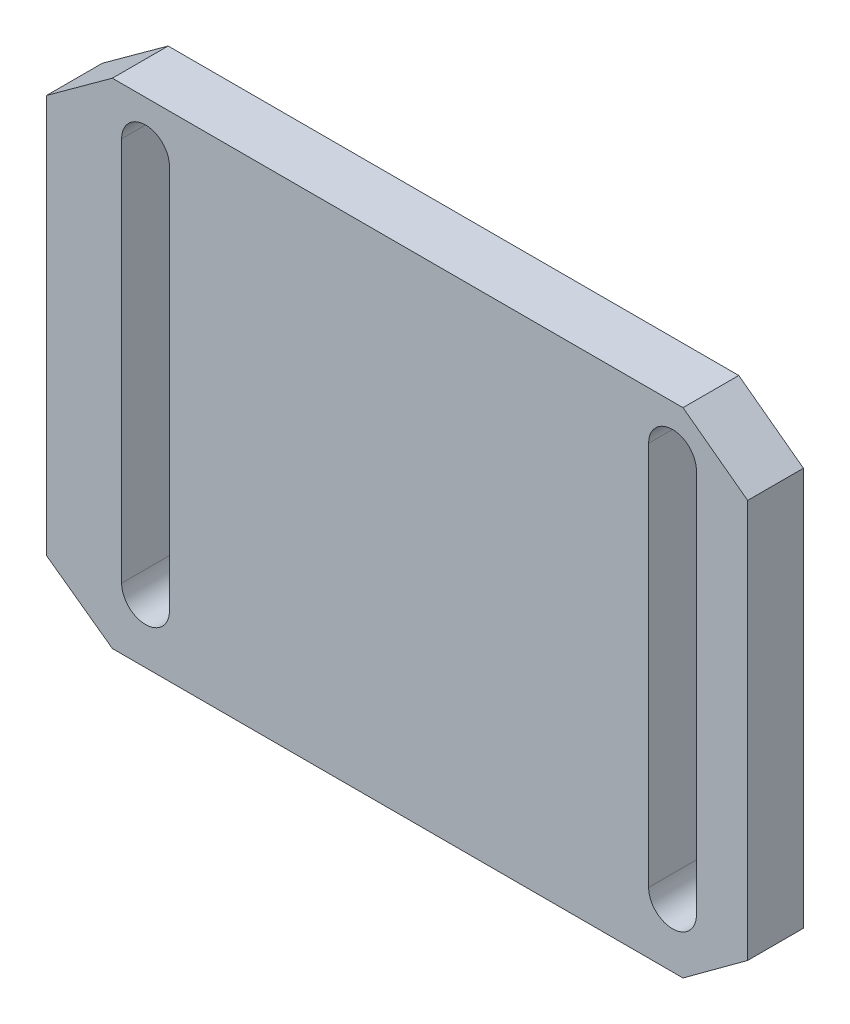
ISO-10303-21;
HEADER;
FILE_DESCRIPTION(('STEP AP214'),'2;1');
FILE_NAME('part.step','',(''),(''),'','','');
FILE_SCHEMA(('AUTOMOTIVE_DESIGN { 1 0 10303 214 1 1 1 1 }'));
ENDSEC;
DATA;
#1=APPLICATION_CONTEXT('core data for automotive mechanical design processes');
#2=APPLICATION_PROTOCOL_DEFINITION('international standard','automotive_design',2000,#1);
#3=PRODUCT_CONTEXT('',#1,'mechanical');
#4=PRODUCT('Part','Part','',(#3));
#5=PRODUCT_RELATED_PRODUCT_CATEGORY('part','',(#4));
#6=PRODUCT_DEFINITION_FORMATION('','',#4);
#7=PRODUCT_DEFINITION_CONTEXT('part definition',#1,'design');
#8=PRODUCT_DEFINITION('design','',#6,#7);
#9=PRODUCT_DEFINITION_SHAPE('','',#8);
#10=(LENGTH_UNIT() NAMED_UNIT(*) SI_UNIT(.MILLI.,.METRE.));
#11=(NAMED_UNIT(*) PLANE_ANGLE_UNIT() SI_UNIT($,.RADIAN.));
#12=(NAMED_UNIT(*) SI_UNIT($,.STERADIAN.) SOLID_ANGLE_UNIT());
#13=UNCERTAINTY_MEASURE_WITH_UNIT(LENGTH_MEASURE(1.E-05),#10,'distance_accuracy_value','');
#14=(GEOMETRIC_REPRESENTATION_CONTEXT(3) GLOBAL_UNCERTAINTY_ASSIGNED_CONTEXT((#13)) GLOBAL_UNIT_ASSIGNED_CONTEXT((#10,
#11,#12)) REPRESENTATION_CONTEXT('',''));
#15=CARTESIAN_POINT('',(0.,0.,0.));
#16=DIRECTION('',(0.,0.,1.));
#17=DIRECTION('',(1.,0.,0.));
#18=AXIS2_PLACEMENT_3D('',#15,#16,#17);
#19=CARTESIAN_POINT('',(0.,0.,7000.));
#20=DIRECTION('',(0.,0.,-1.));
#21=DIRECTION('',(-1.,0.,0.));
#22=AXIS2_PLACEMENT_3D('',#19,#20,#21);
#23=PLANE('',#22);
#24=CARTESIAN_POINT('',(-75575.7324296501,55993.9133640553,7000.));
#25=DIRECTION('',(0.,0.,1.));
#26=DIRECTION('',(1.,0.,0.));
#27=AXIS2_PLACEMENT_3D('',#24,#25,#26);
#28=CIRCLE('',#27,3000.);
#29=CARTESIAN_POINT('',(-72575.7324296501,55993.9133640553,7000.));
#30=VERTEX_POINT('',#29);
#31=CARTESIAN_POINT('',(-78575.7324296501,55993.9133640553,7000.));
#32=VERTEX_POINT('',#31);
#33=EDGE_CURVE('E259',#30,#32,#28,.T.);
#34=ORIENTED_EDGE('',*,*,#33,.F.);
#35=DIRECTION('',(0.,-1.,0.));
#36=VECTOR('',#35,1.);
#37=CARTESIAN_POINT('',(-72575.7324296501,55993.9133640553,7000.));
#38=LINE('',#37,#36);
#39=CARTESIAN_POINT('',(-72575.7324296501,7685.31988644327,7000.));
#40=VERTEX_POINT('',#39);
#41=EDGE_CURVE('E268',#30,#40,#38,.T.);
#42=ORIENTED_EDGE('',*,*,#41,.T.);
#43=CARTESIAN_POINT('',(-75575.7324296501,7685.31988644327,7000.));
#44=DIRECTION('',(0.,0.,1.));
#45=DIRECTION('',(1.,0.,0.));
#46=AXIS2_PLACEMENT_3D('',#43,#44,#45);
#47=CIRCLE('',#46,2999.99999999999);
#48=CARTESIAN_POINT('',(-78575.7324296501,7685.31988644327,7000.));
#49=VERTEX_POINT('',#48);
#50=EDGE_CURVE('E262',#49,#40,#47,.T.);
#51=ORIENTED_EDGE('',*,*,#50,.F.);
#52=DIRECTION('',(0.,-1.,0.));
#53=VECTOR('',#52,1.);
#54=CARTESIAN_POINT('',(-78575.7324296501,55993.9133640553,7000.));
#55=LINE('',#54,#53);
#56=EDGE_CURVE('E265',#32,#49,#55,.T.);
#57=ORIENTED_EDGE('',*,*,#56,.F.);
#58=EDGE_LOOP('',(#34,#42,#51,#57));
#59=FACE_BOUND('',#58,.T.);
#60=DIRECTION('',(-0.810686411900085,0.585480607330906,0.));
#61=VECTOR('',#60,1.);
#62=CARTESIAN_POINT('',(-79740.5270045505,-6.08663594470046,7000.));
#63=LINE('',#62,#61);
#64=CARTESIAN_POINT('',(-79740.5270045505,-6.08663594470046,7000.));
#65=VERTEX_POINT('',#64);
#66=CARTESIAN_POINT('',(-87997.4248847926,5957.074352856,7000.));
#67=VERTEX_POINT('',#66);
#68=EDGE_CURVE('E295',#65,#67,#63,.T.);
#69=ORIENTED_EDGE('',*,*,#68,.F.);
#70=DIRECTION('',(1.,0.,0.));
#71=VECTOR('',#70,1.);
#72=CARTESIAN_POINT('',(-79740.5270045505,-6.08663594470046,7000.));
#73=LINE('',#72,#71);
#74=CARTESIAN_POINT('',(-8114.14575819188,-6.08663594470046,7000.));
#75=VERTEX_POINT('',#74);
#76=EDGE_CURVE('E307',#65,#75,#73,.T.);
#77=ORIENTED_EDGE('',*,*,#76,.T.);
#78=DIRECTION('',(0.80588864150749,0.5920671393425,0.));
#79=VECTOR('',#78,1.);
#80=CARTESIAN_POINT('',(-8114.14575819188,-6.08663594470046,7000.));
#81=LINE('',#80,#79);
#82=CARTESIAN_POINT('',(2.57511520737252,5957.074352856,7000.));
#83=VERTEX_POINT('',#82);
#84=EDGE_CURVE('E306',#75,#83,#81,.T.);
#85=ORIENTED_EDGE('',*,*,#84,.T.);
#86=DIRECTION('',(0.,-1.,0.));
#87=VECTOR('',#86,1.);
#88=CARTESIAN_POINT('',(2.57511520736639,55969.0740995109,7000.));
#89=LINE('',#88,#87);
#90=CARTESIAN_POINT('',(2.57511520736639,55969.0740995109,7000.));
#91=VERTEX_POINT('',#90);
#92=EDGE_CURVE('E304',#91,#83,#89,.T.);
#93=ORIENTED_EDGE('',*,*,#92,.F.);
#94=DIRECTION('',(-0.80296754052975,0.596022758672523,0.));
#95=VECTOR('',#94,1.);
#96=CARTESIAN_POINT('',(2.57511520736639,55969.0740995109,7000.));
#97=LINE('',#96,#95);
#98=CARTESIAN_POINT('',(-8114.14575819188,61993.9133640553,7000.));
#99=VERTEX_POINT('',#98);
#100=EDGE_CURVE('E301',#91,#99,#97,.T.);
#101=ORIENTED_EDGE('',*,*,#100,.T.);
#102=DIRECTION('',(1.,0.,0.));
#103=VECTOR('',#102,1.);
#104=CARTESIAN_POINT('',(-79740.5270045505,61993.9133640553,7000.));
#105=LINE('',#104,#103);
#106=CARTESIAN_POINT('',(-79740.5270045505,61993.9133640553,7000.));
#107=VERTEX_POINT('',#106);
#108=EDGE_CURVE('E300',#107,#99,#105,.T.);
#109=ORIENTED_EDGE('',*,*,#108,.F.);
#110=DIRECTION('',(-0.80896981760848,-0.587850180061639,0.));
#111=VECTOR('',#110,1.);
#112=CARTESIAN_POINT('',(-79740.5270045505,61993.9133640553,7000.));
#113=LINE('',#112,#111);
#114=CARTESIAN_POINT('',(-87997.4248847926,55993.9133640553,7000.));
#115=VERTEX_POINT('',#114);
#116=EDGE_CURVE('E299',#107,#115,#113,.T.);
#117=ORIENTED_EDGE('',*,*,#116,.T.);
#118=DIRECTION('',(0.,-1.,0.));
#119=VECTOR('',#118,1.);
#120=CARTESIAN_POINT('',(-87997.4248847926,55993.9133640553,7000.));
#121=LINE('',#120,#119);
#122=EDGE_CURVE('E293',#115,#67,#121,.T.);
#123=ORIENTED_EDGE('',*,*,#122,.T.);
#124=EDGE_LOOP('',(#69,#77,#85,#93,#101,#109,#117,#123));
#125=FACE_BOUND('',#124,.T.);
#126=CARTESIAN_POINT('',(-9427.33930635532,55969.0740995109,7000.));
#127=DIRECTION('',(0.,0.,1.));
#128=DIRECTION('',(1.,0.,0.));
#129=AXIS2_PLACEMENT_3D('',#126,#127,#128);
#130=CIRCLE('',#129,3000.);
#131=CARTESIAN_POINT('',(-6427.33930635532,55969.0740995109,7000.));
#132=VERTEX_POINT('',#131);
#133=CARTESIAN_POINT('',(-12427.3393063553,55969.0740995109,7000.));
#134=VERTEX_POINT('',#133);
#135=EDGE_CURVE('E224',#132,#134,#130,.T.);
#136=ORIENTED_EDGE('',*,*,#135,.F.);
#137=DIRECTION('',(0.,-1.,0.));
#138=VECTOR('',#137,1.);
#139=CARTESIAN_POINT('',(-6427.33930635532,55969.0740995109,7000.));
#140=LINE('',#139,#138);
#141=CARTESIAN_POINT('',(-6427.33930635532,7685.31988644327,7000.));
#142=VERTEX_POINT('',#141);
#143=EDGE_CURVE('E250',#132,#142,#140,.T.);
#144=ORIENTED_EDGE('',*,*,#143,.T.);
#145=CARTESIAN_POINT('',(-9427.33930635532,7685.31988644327,7000.));
#146=DIRECTION('',(0.,0.,1.));
#147=DIRECTION('',(1.,0.,0.));
#148=AXIS2_PLACEMENT_3D('',#145,#146,#147);
#149=CIRCLE('',#148,3000.);
#150=CARTESIAN_POINT('',(-12427.3393063553,7685.31988644327,7000.));
#151=VERTEX_POINT('',#150);
#152=EDGE_CURVE('E245',#151,#142,#149,.T.);
#153=ORIENTED_EDGE('',*,*,#152,.F.);
#154=DIRECTION('',(0.,-1.,0.));
#155=VECTOR('',#154,1.);
#156=CARTESIAN_POINT('',(-12427.3393063553,55969.0740995109,7000.));
#157=LINE('',#156,#155);
#158=EDGE_CURVE('E232',#134,#151,#157,.T.);
#159=ORIENTED_EDGE('',*,*,#158,.F.);
#160=EDGE_LOOP('',(#136,#144,#153,#159));
#161=FACE_BOUND('',#160,.T.);
#162=ADVANCED_FACE('F112',(#59,#125,#161),#23,.F.);
#163=CARTESIAN_POINT('',(0.,0.,0.));
#164=DIRECTION('',(0.,0.,-1.));
#165=DIRECTION('',(-1.,0.,0.));
#166=AXIS2_PLACEMENT_3D('',#163,#164,#165);
#167=PLANE('',#166);
#168=DIRECTION('',(-0.810686411900085,0.585480607330906,0.));
#169=VECTOR('',#168,1.);
#170=CARTESIAN_POINT('',(-79740.5270045505,-6.08663594470046,0.));
#171=LINE('',#170,#169);
#172=CARTESIAN_POINT('',(-79740.5270045505,-6.08663594470046,0.));
#173=VERTEX_POINT('',#172);
#174=CARTESIAN_POINT('',(-87997.4248847926,5957.074352856,0.));
#175=VERTEX_POINT('',#174);
#176=EDGE_CURVE('E292',#173,#175,#171,.T.);
#177=ORIENTED_EDGE('',*,*,#176,.T.);
#178=DIRECTION('',(0.,-1.,0.));
#179=VECTOR('',#178,1.);
#180=CARTESIAN_POINT('',(-87997.4248847926,55993.9133640553,0.));
#181=LINE('',#180,#179);
#182=CARTESIAN_POINT('',(-87997.4248847926,55993.9133640553,0.));
#183=VERTEX_POINT('',#182);
#184=EDGE_CURVE('E312',#183,#175,#181,.T.);
#185=ORIENTED_EDGE('',*,*,#184,.F.);
#186=DIRECTION('',(-0.80896981760848,-0.587850180061639,0.));
#187=VECTOR('',#186,1.);
#188=CARTESIAN_POINT('',(-79740.5270045505,61993.9133640553,0.));
#189=LINE('',#188,#187);
#190=CARTESIAN_POINT('',(-79740.5270045505,61993.9133640553,0.));
#191=VERTEX_POINT('',#190);
#192=EDGE_CURVE('E320',#191,#183,#189,.T.);
#193=ORIENTED_EDGE('',*,*,#192,.F.);
#194=DIRECTION('',(1.,0.,0.));
#195=VECTOR('',#194,1.);
#196=CARTESIAN_POINT('',(-79740.5270045505,61993.9133640553,0.));
#197=LINE('',#196,#195);
#198=CARTESIAN_POINT('',(-8114.14575819188,61993.9133640553,0.));
#199=VERTEX_POINT('',#198);
#200=EDGE_CURVE('E317',#191,#199,#197,.T.);
#201=ORIENTED_EDGE('',*,*,#200,.T.);
#202=DIRECTION('',(-0.80296754052975,0.596022758672523,0.));
#203=VECTOR('',#202,1.);
#204=CARTESIAN_POINT('',(2.57511520736639,55969.0740995109,0.));
#205=LINE('',#204,#203);
#206=CARTESIAN_POINT('',(2.57511520736639,55969.0740995109,0.));
#207=VERTEX_POINT('',#206);
#208=EDGE_CURVE('E325',#207,#199,#205,.T.);
#209=ORIENTED_EDGE('',*,*,#208,.F.);
#210=DIRECTION('',(0.,-1.,0.));
#211=VECTOR('',#210,1.);
#212=CARTESIAN_POINT('',(2.57511520736639,55969.0740995109,0.));
#213=LINE('',#212,#211);
#214=CARTESIAN_POINT('',(2.57511520737252,5957.074352856,0.));
#215=VERTEX_POINT('',#214);
#216=EDGE_CURVE('E324',#207,#215,#213,.T.);
#217=ORIENTED_EDGE('',*,*,#216,.T.);
#218=DIRECTION('',(0.80588864150749,0.5920671393425,0.));
#219=VECTOR('',#218,1.);
#220=CARTESIAN_POINT('',(-8114.14575819188,-6.08663594470046,0.));
#221=LINE('',#220,#219);
#222=CARTESIAN_POINT('',(-8114.14575819188,-6.08663594470046,0.));
#223=VERTEX_POINT('',#222);
#224=EDGE_CURVE('E329',#223,#215,#221,.T.);
#225=ORIENTED_EDGE('',*,*,#224,.F.);
#226=DIRECTION('',(1.,0.,0.));
#227=VECTOR('',#226,1.);
#228=CARTESIAN_POINT('',(-79740.5270045505,-6.08663594470046,0.));
#229=LINE('',#228,#227);
#230=EDGE_CURVE('E296',#173,#223,#229,.T.);
#231=ORIENTED_EDGE('',*,*,#230,.F.);
#232=EDGE_LOOP('',(#177,#185,#193,#201,#209,#217,#225,#231));
#233=FACE_BOUND('',#232,.T.);
#234=DIRECTION('',(0.,-1.,0.));
#235=VECTOR('',#234,1.);
#236=CARTESIAN_POINT('',(-72575.7324296501,55993.9133640553,0.));
#237=LINE('',#236,#235);
#238=CARTESIAN_POINT('',(-72575.7324296501,55993.9133640553,0.));
#239=VERTEX_POINT('',#238);
#240=CARTESIAN_POINT('',(-72575.7324296501,7685.31988644327,0.));
#241=VERTEX_POINT('',#240);
#242=EDGE_CURVE('E261',#239,#241,#237,.T.);
#243=ORIENTED_EDGE('',*,*,#242,.F.);
#244=CARTESIAN_POINT('',(-75575.7324296501,55993.9133640553,0.));
#245=DIRECTION('',(0.,0.,1.));
#246=DIRECTION('',(1.,0.,0.));
#247=AXIS2_PLACEMENT_3D('',#244,#245,#246);
#248=CIRCLE('',#247,3000.);
#249=CARTESIAN_POINT('',(-78575.7324296501,55993.9133640553,0.));
#250=VERTEX_POINT('',#249);
#251=EDGE_CURVE('E241',#239,#250,#248,.T.);
#252=ORIENTED_EDGE('',*,*,#251,.T.);
#253=DIRECTION('',(0.,-1.,0.));
#254=VECTOR('',#253,1.);
#255=CARTESIAN_POINT('',(-78575.7324296501,55993.9133640553,0.));
#256=LINE('',#255,#254);
#257=CARTESIAN_POINT('',(-78575.7324296501,7685.31988644327,0.));
#258=VERTEX_POINT('',#257);
#259=EDGE_CURVE('E272',#250,#258,#256,.T.);
#260=ORIENTED_EDGE('',*,*,#259,.T.);
#261=CARTESIAN_POINT('',(-75575.7324296501,7685.31988644327,0.));
#262=DIRECTION('',(0.,0.,1.));
#263=DIRECTION('',(1.,0.,0.));
#264=AXIS2_PLACEMENT_3D('',#261,#262,#263);
#265=CIRCLE('',#264,2999.99999999999);
#266=EDGE_CURVE('E280',#258,#241,#265,.T.);
#267=ORIENTED_EDGE('',*,*,#266,.T.);
#268=EDGE_LOOP('',(#243,#252,#260,#267));
#269=FACE_BOUND('',#268,.T.);
#270=DIRECTION('',(0.,-1.,0.));
#271=VECTOR('',#270,1.);
#272=CARTESIAN_POINT('',(-6427.33930635532,55969.0740995109,0.));
#273=LINE('',#272,#271);
#274=CARTESIAN_POINT('',(-6427.33930635532,55969.0740995109,0.));
#275=VERTEX_POINT('',#274);
#276=CARTESIAN_POINT('',(-6427.33930635532,7685.31988644327,0.));
#277=VERTEX_POINT('',#276);
#278=EDGE_CURVE('E233',#275,#277,#273,.T.);
#279=ORIENTED_EDGE('',*,*,#278,.F.);
#280=CARTESIAN_POINT('',(-9427.33930635532,55969.0740995109,0.));
#281=DIRECTION('',(0.,0.,1.));
#282=DIRECTION('',(1.,0.,0.));
#283=AXIS2_PLACEMENT_3D('',#280,#281,#282);
#284=CIRCLE('',#283,3000.);
#285=CARTESIAN_POINT('',(-12427.3393063553,55969.0740995109,0.));
#286=VERTEX_POINT('',#285);
#287=EDGE_CURVE('E136',#275,#286,#284,.T.);
#288=ORIENTED_EDGE('',*,*,#287,.T.);
#289=DIRECTION('',(0.,-1.,0.));
#290=VECTOR('',#289,1.);
#291=CARTESIAN_POINT('',(-12427.3393063553,55969.0740995109,0.));
#292=LINE('',#291,#290);
#293=CARTESIAN_POINT('',(-12427.3393063553,7685.31988644327,0.));
#294=VERTEX_POINT('',#293);
#295=EDGE_CURVE('E238',#286,#294,#292,.T.);
#296=ORIENTED_EDGE('',*,*,#295,.T.);
#297=CARTESIAN_POINT('',(-9427.33930635532,7685.31988644327,0.));
#298=DIRECTION('',(0.,0.,1.));
#299=DIRECTION('',(1.,0.,0.));
#300=AXIS2_PLACEMENT_3D('',#297,#298,#299);
#301=CIRCLE('',#300,3000.);
#302=EDGE_CURVE('E254',#294,#277,#301,.T.);
#303=ORIENTED_EDGE('',*,*,#302,.T.);
#304=EDGE_LOOP('',(#279,#288,#296,#303));
#305=FACE_BOUND('',#304,.T.);
#306=ADVANCED_FACE('F352',(#233,#269,#305),#167,.T.);
#307=CARTESIAN_POINT('',(-79740.5270045505,-6.08663594470046,7000.));
#308=DIRECTION('',(-0.585480607330905,-0.810686411900085,0.));
#309=DIRECTION('',(0.810686411900085,-0.585480607330906,0.));
#310=AXIS2_PLACEMENT_3D('',#307,#308,#309);
#311=PLANE('',#310);
#312=ORIENTED_EDGE('',*,*,#176,.F.);
#313=DIRECTION('',(0.,0.,-1.));
#314=VECTOR('',#313,1.);
#315=CARTESIAN_POINT('',(-79740.5270045505,-6.08663594470046,7000.));
#316=LINE('',#315,#314);
#317=EDGE_CURVE('E12',#65,#173,#316,.T.);
#318=ORIENTED_EDGE('',*,*,#317,.F.);
#319=ORIENTED_EDGE('',*,*,#68,.T.);
#320=DIRECTION('',(0.,0.,-1.));
#321=VECTOR('',#320,1.);
#322=CARTESIAN_POINT('',(-87997.4248847926,5957.074352856,7000.));
#323=LINE('',#322,#321);
#324=EDGE_CURVE('E113',#67,#175,#323,.T.);
#325=ORIENTED_EDGE('',*,*,#324,.T.);
#326=EDGE_LOOP('',(#312,#318,#319,#325));
#327=FACE_BOUND('',#326,.T.);
#328=ADVANCED_FACE('F111',(#327),#311,.T.);
#329=CARTESIAN_POINT('',(-79740.5270045505,-6.08663594470046,7000.));
#330=DIRECTION('',(0.,1.,0.));
#331=DIRECTION('',(0.,0.,1.));
#332=AXIS2_PLACEMENT_3D('',#329,#330,#331);
#333=PLANE('',#332);
#334=ORIENTED_EDGE('',*,*,#230,.T.);
#335=DIRECTION('',(0.,0.,-1.));
#336=VECTOR('',#335,1.);
#337=CARTESIAN_POINT('',(-8114.14575819188,-6.08663594470046,7000.));
#338=LINE('',#337,#336);
#339=EDGE_CURVE('E120',#75,#223,#338,.T.);
#340=ORIENTED_EDGE('',*,*,#339,.F.);
#341=ORIENTED_EDGE('',*,*,#76,.F.);
#342=ORIENTED_EDGE('',*,*,#317,.T.);
#343=EDGE_LOOP('',(#334,#340,#341,#342));
#344=FACE_BOUND('',#343,.T.);
#345=ADVANCED_FACE('F359',(#344),#333,.F.);
#346=CARTESIAN_POINT('',(-8114.14575819188,-6.08663594470046,7000.));
#347=DIRECTION('',(-0.5920671393425,0.80588864150749,0.));
#348=DIRECTION('',(-0.80588864150749,-0.5920671393425,0.));
#349=AXIS2_PLACEMENT_3D('',#346,#347,#348);
#350=PLANE('',#349);
#351=ORIENTED_EDGE('',*,*,#224,.T.);
#352=DIRECTION('',(0.,0.,-1.));
#353=VECTOR('',#352,1.);
#354=CARTESIAN_POINT('',(2.57511520737252,5957.074352856,7000.));
#355=LINE('',#354,#353);
#356=EDGE_CURVE('E333',#83,#215,#355,.T.);
#357=ORIENTED_EDGE('',*,*,#356,.F.);
#358=ORIENTED_EDGE('',*,*,#84,.F.);
#359=ORIENTED_EDGE('',*,*,#339,.T.);
#360=EDGE_LOOP('',(#351,#357,#358,#359));
#361=FACE_BOUND('',#360,.T.);
#362=ADVANCED_FACE('F362',(#361),#350,.F.);
#363=CARTESIAN_POINT('',(2.57511520736639,55969.0740995109,7000.));
#364=DIRECTION('',(1.,0.,0.));
#365=DIRECTION('',(0.,1.,0.));
#366=AXIS2_PLACEMENT_3D('',#363,#364,#365);
#367=PLANE('',#366);
#368=ORIENTED_EDGE('',*,*,#216,.F.);
#369=DIRECTION('',(0.,0.,-1.));
#370=VECTOR('',#369,1.);
#371=CARTESIAN_POINT('',(2.57511520736639,55969.0740995109,7000.));
#372=LINE('',#371,#370);
#373=EDGE_CURVE('E337',#91,#207,#372,.T.);
#374=ORIENTED_EDGE('',*,*,#373,.F.);
#375=ORIENTED_EDGE('',*,*,#92,.T.);
#376=ORIENTED_EDGE('',*,*,#356,.T.);
#377=EDGE_LOOP('',(#368,#374,#375,#376));
#378=FACE_BOUND('',#377,.T.);
#379=ADVANCED_FACE('F385',(#378),#367,.T.);
#380=CARTESIAN_POINT('',(2.57511520736639,55969.0740995109,7000.));
#381=DIRECTION('',(-0.596022758672523,-0.80296754052975,0.));
#382=DIRECTION('',(0.80296754052975,-0.596022758672523,0.));
#383=AXIS2_PLACEMENT_3D('',#380,#381,#382);
#384=PLANE('',#383);
#385=ORIENTED_EDGE('',*,*,#208,.T.);
#386=DIRECTION('',(0.,0.,-1.));
#387=VECTOR('',#386,1.);
#388=CARTESIAN_POINT('',(-8114.14575819188,61993.9133640553,7000.));
#389=LINE('',#388,#387);
#390=EDGE_CURVE('E336',#99,#199,#389,.T.);
#391=ORIENTED_EDGE('',*,*,#390,.F.);
#392=ORIENTED_EDGE('',*,*,#100,.F.);
#393=ORIENTED_EDGE('',*,*,#373,.T.);
#394=EDGE_LOOP('',(#385,#391,#392,#393));
#395=FACE_BOUND('',#394,.T.);
#396=ADVANCED_FACE('F378',(#395),#384,.F.);
#397=CARTESIAN_POINT('',(-79740.5270045505,61993.9133640553,7000.));
#398=DIRECTION('',(0.,1.,0.));
#399=DIRECTION('',(0.,0.,1.));
#400=AXIS2_PLACEMENT_3D('',#397,#398,#399);
#401=PLANE('',#400);
#402=ORIENTED_EDGE('',*,*,#200,.F.);
#403=DIRECTION('',(0.,0.,-1.));
#404=VECTOR('',#403,1.);
#405=CARTESIAN_POINT('',(-79740.5270045505,61993.9133640553,7000.));
#406=LINE('',#405,#404);
#407=EDGE_CURVE('E338',#107,#191,#406,.T.);
#408=ORIENTED_EDGE('',*,*,#407,.F.);
#409=ORIENTED_EDGE('',*,*,#108,.T.);
#410=ORIENTED_EDGE('',*,*,#390,.T.);
#411=EDGE_LOOP('',(#402,#408,#409,#410));
#412=FACE_BOUND('',#411,.T.);
#413=ADVANCED_FACE('F373',(#412),#401,.T.);
#414=CARTESIAN_POINT('',(-79740.5270045505,61993.9133640553,7000.));
#415=DIRECTION('',(0.587850180061639,-0.808969817608481,0.));
#416=DIRECTION('',(0.808969817608481,0.587850180061639,0.));
#417=AXIS2_PLACEMENT_3D('',#414,#415,#416);
#418=PLANE('',#417);
#419=ORIENTED_EDGE('',*,*,#192,.T.);
#420=DIRECTION('',(0.,0.,-1.));
#421=VECTOR('',#420,1.);
#422=CARTESIAN_POINT('',(-87997.4248847926,55993.9133640553,7000.));
#423=LINE('',#422,#421);
#424=EDGE_CURVE('E341',#115,#183,#423,.T.);
#425=ORIENTED_EDGE('',*,*,#424,.F.);
#426=ORIENTED_EDGE('',*,*,#116,.F.);
#427=ORIENTED_EDGE('',*,*,#407,.T.);
#428=EDGE_LOOP('',(#419,#425,#426,#427));
#429=FACE_BOUND('',#428,.T.);
#430=ADVANCED_FACE('F372',(#429),#418,.F.);
#431=CARTESIAN_POINT('',(-87997.4248847926,55993.9133640553,7000.));
#432=DIRECTION('',(1.,0.,0.));
#433=DIRECTION('',(0.,1.,0.));
#434=AXIS2_PLACEMENT_3D('',#431,#432,#433);
#435=PLANE('',#434);
#436=ORIENTED_EDGE('',*,*,#184,.T.);
#437=ORIENTED_EDGE('',*,*,#324,.F.);
#438=ORIENTED_EDGE('',*,*,#122,.F.);
#439=ORIENTED_EDGE('',*,*,#424,.T.);
#440=EDGE_LOOP('',(#436,#437,#438,#439));
#441=FACE_BOUND('',#440,.T.);
#442=ADVANCED_FACE('F353',(#441),#435,.F.);
#443=CARTESIAN_POINT('',(-75575.7324296501,55993.9133640553,7000.));
#444=DIRECTION('',(0.,0.,-1.));
#445=DIRECTION('',(-1.,0.,0.));
#446=AXIS2_PLACEMENT_3D('',#443,#444,#445);
#447=CYLINDRICAL_SURFACE('',#446,3000.);
#448=ORIENTED_EDGE('',*,*,#251,.F.);
#449=DIRECTION('',(0.,0.,-1.));
#450=VECTOR('',#449,1.);
#451=CARTESIAN_POINT('',(-72575.7324296501,55993.9133640553,7000.));
#452=LINE('',#451,#450);
#453=EDGE_CURVE('E271',#30,#239,#452,.T.);
#454=ORIENTED_EDGE('',*,*,#453,.F.);
#455=ORIENTED_EDGE('',*,*,#33,.T.);
#456=DIRECTION('',(0.,0.,-1.));
#457=VECTOR('',#456,1.);
#458=CARTESIAN_POINT('',(-78575.7324296501,55993.9133640553,7000.));
#459=LINE('',#458,#457);
#460=EDGE_CURVE('E289',#32,#250,#459,.T.);
#461=ORIENTED_EDGE('',*,*,#460,.T.);
#462=EDGE_LOOP('',(#448,#454,#455,#461));
#463=FACE_BOUND('',#462,.T.);
#464=ADVANCED_FACE('F397',(#463),#447,.F.);
#465=CARTESIAN_POINT('',(-78575.7324296501,55993.9133640553,7000.));
#466=DIRECTION('',(1.,0.,0.));
#467=DIRECTION('',(0.,1.,0.));
#468=AXIS2_PLACEMENT_3D('',#465,#466,#467);
#469=PLANE('',#468);
#470=ORIENTED_EDGE('',*,*,#259,.F.);
#471=ORIENTED_EDGE('',*,*,#460,.F.);
#472=ORIENTED_EDGE('',*,*,#56,.T.);
#473=DIRECTION('',(0.,0.,-1.));
#474=VECTOR('',#473,1.);
#475=CARTESIAN_POINT('',(-78575.7324296501,7685.31988644327,7000.));
#476=LINE('',#475,#474);
#477=EDGE_CURVE('E286',#49,#258,#476,.T.);
#478=ORIENTED_EDGE('',*,*,#477,.T.);
#479=EDGE_LOOP('',(#470,#471,#472,#478));
#480=FACE_BOUND('',#479,.T.);
#481=ADVANCED_FACE('F466',(#480),#469,.T.);
#482=CARTESIAN_POINT('',(-75575.7324296501,7685.31988644327,7000.));
#483=DIRECTION('',(0.,0.,-1.));
#484=DIRECTION('',(-1.,0.,0.));
#485=AXIS2_PLACEMENT_3D('',#482,#483,#484);
#486=CYLINDRICAL_SURFACE('',#485,2999.99999999999);
#487=ORIENTED_EDGE('',*,*,#266,.F.);
#488=ORIENTED_EDGE('',*,*,#477,.F.);
#489=ORIENTED_EDGE('',*,*,#50,.T.);
#490=DIRECTION('',(0.,0.,-1.));
#491=VECTOR('',#490,1.);
#492=CARTESIAN_POINT('',(-72575.7324296501,7685.31988644327,7000.));
#493=LINE('',#492,#491);
#494=EDGE_CURVE('E281',#40,#241,#493,.T.);
#495=ORIENTED_EDGE('',*,*,#494,.T.);
#496=EDGE_LOOP('',(#487,#488,#489,#495));
#497=FACE_BOUND('',#496,.T.);
#498=ADVANCED_FACE('F474',(#497),#486,.F.);
#499=CARTESIAN_POINT('',(-72575.7324296501,55993.9133640553,7000.));
#500=DIRECTION('',(1.,0.,0.));
#501=DIRECTION('',(0.,0.,-1.));
#502=AXIS2_PLACEMENT_3D('',#499,#500,#501);
#503=PLANE('',#502);
#504=ORIENTED_EDGE('',*,*,#242,.T.);
#505=ORIENTED_EDGE('',*,*,#494,.F.);
#506=ORIENTED_EDGE('',*,*,#41,.F.);
#507=ORIENTED_EDGE('',*,*,#453,.T.);
#508=EDGE_LOOP('',(#504,#505,#506,#507));
#509=FACE_BOUND('',#508,.T.);
#510=ADVANCED_FACE('F482',(#509),#503,.F.);
#511=CARTESIAN_POINT('',(-9427.33930635532,55969.0740995109,7000.));
#512=DIRECTION('',(0.,0.,-1.));
#513=DIRECTION('',(-1.,0.,0.));
#514=AXIS2_PLACEMENT_3D('',#511,#512,#513);
#515=CYLINDRICAL_SURFACE('',#514,3000.);
#516=ORIENTED_EDGE('',*,*,#287,.F.);
#517=DIRECTION('',(0.,0.,-1.));
#518=VECTOR('',#517,1.);
#519=CARTESIAN_POINT('',(-6427.33930635532,55969.0740995109,7000.));
#520=LINE('',#519,#518);
#521=EDGE_CURVE('E227',#132,#275,#520,.T.);
#522=ORIENTED_EDGE('',*,*,#521,.F.);
#523=ORIENTED_EDGE('',*,*,#135,.T.);
#524=DIRECTION('',(0.,0.,-1.));
#525=VECTOR('',#524,1.);
#526=CARTESIAN_POINT('',(-12427.3393063553,55969.0740995109,7000.));
#527=LINE('',#526,#525);
#528=EDGE_CURVE('E228',#134,#286,#527,.T.);
#529=ORIENTED_EDGE('',*,*,#528,.T.);
#530=EDGE_LOOP('',(#516,#522,#523,#529));
#531=FACE_BOUND('',#530,.T.);
#532=ADVANCED_FACE('F230',(#531),#515,.F.);
#533=CARTESIAN_POINT('',(-12427.3393063553,55969.0740995109,7000.));
#534=DIRECTION('',(1.,0.,0.));
#535=DIRECTION('',(0.,1.,0.));
#536=AXIS2_PLACEMENT_3D('',#533,#534,#535);
#537=PLANE('',#536);
#538=ORIENTED_EDGE('',*,*,#295,.F.);
#539=ORIENTED_EDGE('',*,*,#528,.F.);
#540=ORIENTED_EDGE('',*,*,#158,.T.);
#541=DIRECTION('',(0.,0.,-1.));
#542=VECTOR('',#541,1.);
#543=CARTESIAN_POINT('',(-12427.3393063553,7685.31988644327,7000.));
#544=LINE('',#543,#542);
#545=EDGE_CURVE('E242',#151,#294,#544,.T.);
#546=ORIENTED_EDGE('',*,*,#545,.T.);
#547=EDGE_LOOP('',(#538,#539,#540,#546));
#548=FACE_BOUND('',#547,.T.);
#549=ADVANCED_FACE('F240',(#548),#537,.T.);
#550=CARTESIAN_POINT('',(-9427.33930635532,7685.31988644327,7000.));
#551=DIRECTION('',(0.,0.,-1.));
#552=DIRECTION('',(-1.,0.,0.));
#553=AXIS2_PLACEMENT_3D('',#550,#551,#552);
#554=CYLINDRICAL_SURFACE('',#553,3000.);
#555=ORIENTED_EDGE('',*,*,#302,.F.);
#556=ORIENTED_EDGE('',*,*,#545,.F.);
#557=ORIENTED_EDGE('',*,*,#152,.T.);
#558=DIRECTION('',(0.,0.,-1.));
#559=VECTOR('',#558,1.);
#560=CARTESIAN_POINT('',(-6427.33930635532,7685.31988644327,7000.));
#561=LINE('',#560,#559);
#562=EDGE_CURVE('E126',#142,#277,#561,.T.);
#563=ORIENTED_EDGE('',*,*,#562,.T.);
#564=EDGE_LOOP('',(#555,#556,#557,#563));
#565=FACE_BOUND('',#564,.T.);
#566=ADVANCED_FACE('F507',(#565),#554,.F.);
#567=CARTESIAN_POINT('',(-6427.33930635532,55969.0740995109,7000.));
#568=DIRECTION('',(1.,0.,0.));
#569=DIRECTION('',(0.,0.,-1.));
#570=AXIS2_PLACEMENT_3D('',#567,#568,#569);
#571=PLANE('',#570);
#572=ORIENTED_EDGE('',*,*,#278,.T.);
#573=ORIENTED_EDGE('',*,*,#562,.F.);
#574=ORIENTED_EDGE('',*,*,#143,.F.);
#575=ORIENTED_EDGE('',*,*,#521,.T.);
#576=EDGE_LOOP('',(#572,#573,#574,#575));
#577=FACE_BOUND('',#576,.T.);
#578=ADVANCED_FACE('F513',(#577),#571,.F.);
#579=CLOSED_SHELL('',(#162,#306,#328,#345,#362,#379,#396,#413,#430,#442,#464,#481,#498,#510,
#532,#549,#566,#578));
#580=MANIFOLD_SOLID_BREP('B2',#579);
#581=ADVANCED_BREP_SHAPE_REPRESENTATION('',(#18,#580),#14);
#582=SHAPE_DEFINITION_REPRESENTATION(#9,#581);
ENDSEC;
END-ISO-10303-21;
